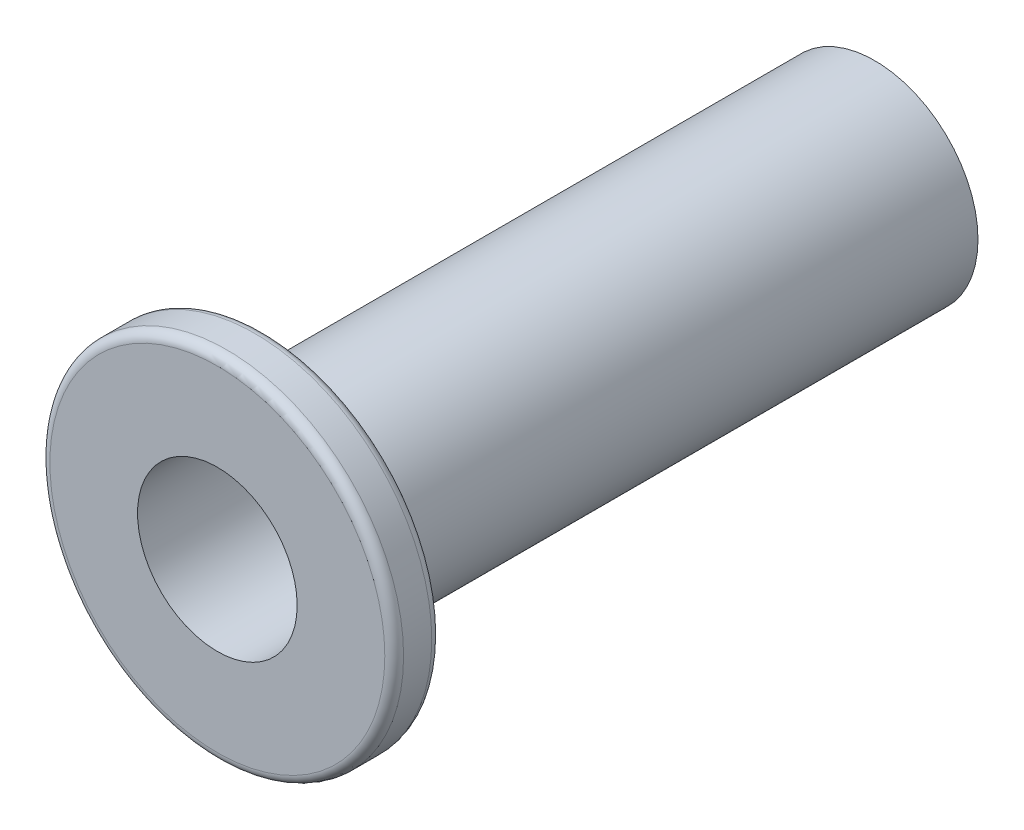
ISO-10303-21;
HEADER;
FILE_DESCRIPTION(('STEP AP214'),'2;1');
FILE_NAME('part.step','',(''),(''),'','','');
FILE_SCHEMA(('AUTOMOTIVE_DESIGN { 1 0 10303 214 1 1 1 1 }'));
ENDSEC;
DATA;
#1=APPLICATION_CONTEXT('core data for automotive mechanical design processes');
#2=APPLICATION_PROTOCOL_DEFINITION('international standard','automotive_design',2000,#1);
#3=PRODUCT_CONTEXT('',#1,'mechanical');
#4=PRODUCT('Part','Part','',(#3));
#5=PRODUCT_RELATED_PRODUCT_CATEGORY('part','',(#4));
#6=PRODUCT_DEFINITION_FORMATION('','',#4);
#7=PRODUCT_DEFINITION_CONTEXT('part definition',#1,'design');
#8=PRODUCT_DEFINITION('design','',#6,#7);
#9=PRODUCT_DEFINITION_SHAPE('','',#8);
#10=(LENGTH_UNIT() NAMED_UNIT(*) SI_UNIT(.MILLI.,.METRE.));
#11=(NAMED_UNIT(*) PLANE_ANGLE_UNIT() SI_UNIT($,.RADIAN.));
#12=(NAMED_UNIT(*) SI_UNIT($,.STERADIAN.) SOLID_ANGLE_UNIT());
#13=UNCERTAINTY_MEASURE_WITH_UNIT(LENGTH_MEASURE(1.E-05),#10,'distance_accuracy_value','');
#14=(GEOMETRIC_REPRESENTATION_CONTEXT(3) GLOBAL_UNCERTAINTY_ASSIGNED_CONTEXT((#13)) GLOBAL_UNIT_ASSIGNED_CONTEXT((#10,
#11,#12)) REPRESENTATION_CONTEXT('',''));
#15=CARTESIAN_POINT('',(0.,0.,0.));
#16=DIRECTION('',(0.,0.,1.));
#17=DIRECTION('',(1.,0.,0.));
#18=AXIS2_PLACEMENT_3D('',#15,#16,#17);
#19=CARTESIAN_POINT('',(0.,0.,120.));
#20=DIRECTION('',(0.,0.,-1.));
#21=DIRECTION('',(-1.,0.,0.));
#22=AXIS2_PLACEMENT_3D('',#19,#20,#21);
#23=CYLINDRICAL_SURFACE('',#22,22.);
#24=CARTESIAN_POINT('',(0.,0.,110.));
#25=DIRECTION('',(0.,0.,1.));
#26=DIRECTION('',(1.,0.,0.));
#27=AXIS2_PLACEMENT_3D('',#24,#25,#26);
#28=CIRCLE('',#27,22.);
#29=CARTESIAN_POINT('',(22.,0.,110.));
#30=VERTEX_POINT('',#29);
#31=EDGE_CURVE('E53',#30,#30,#28,.F.);
#32=ORIENTED_EDGE('',*,*,#31,.T.);
#33=EDGE_LOOP('',(#32));
#34=FACE_BOUND('',#33,.T.);
#35=CARTESIAN_POINT('',(0.,0.,-10.));
#36=DIRECTION('',(0.,0.,-1.));
#37=DIRECTION('',(-1.,0.,0.));
#38=AXIS2_PLACEMENT_3D('',#35,#36,#37);
#39=CIRCLE('',#38,22.);
#40=CARTESIAN_POINT('',(-22.,0.,-10.));
#41=VERTEX_POINT('',#40);
#42=EDGE_CURVE('E65',#41,#41,#39,.T.);
#43=ORIENTED_EDGE('',*,*,#42,.F.);
#44=EDGE_LOOP('',(#43));
#45=FACE_BOUND('',#44,.T.);
#46=ADVANCED_FACE('F33',(#34,#45),#23,.T.);
#47=CARTESIAN_POINT('',(0.,0.,120.));
#48=DIRECTION('',(0.,0.,-1.));
#49=DIRECTION('',(-1.,0.,0.));
#50=AXIS2_PLACEMENT_3D('',#47,#48,#49);
#51=CYLINDRICAL_SURFACE('',#50,17.);
#52=CARTESIAN_POINT('',(0.,0.,0.));
#53=DIRECTION('',(0.,0.,1.));
#54=DIRECTION('',(1.,0.,0.));
#55=AXIS2_PLACEMENT_3D('',#52,#53,#54);
#56=CIRCLE('',#55,17.);
#57=CARTESIAN_POINT('',(17.,0.,0.));
#58=VERTEX_POINT('',#57);
#59=EDGE_CURVE('E59',#58,#58,#56,.T.);
#60=ORIENTED_EDGE('',*,*,#59,.F.);
#61=EDGE_LOOP('',(#60));
#62=FACE_BOUND('',#61,.T.);
#63=CARTESIAN_POINT('',(0.,0.,130.));
#64=DIRECTION('',(0.,0.,1.));
#65=DIRECTION('',(1.,0.,0.));
#66=AXIS2_PLACEMENT_3D('',#63,#64,#65);
#67=CIRCLE('',#66,17.);
#68=CARTESIAN_POINT('',(17.,0.,130.));
#69=VERTEX_POINT('',#68);
#70=EDGE_CURVE('E62',#69,#69,#67,.T.);
#71=ORIENTED_EDGE('',*,*,#70,.T.);
#72=EDGE_LOOP('',(#71));
#73=FACE_BOUND('',#72,.T.);
#74=ADVANCED_FACE('F72',(#62,#73),#51,.F.);
#75=CARTESIAN_POINT('',(0.,0.,130.));
#76=DIRECTION('',(0.,0.,1.));
#77=DIRECTION('',(1.,0.,0.));
#78=AXIS2_PLACEMENT_3D('',#75,#76,#77);
#79=PLANE('',#78);
#80=CARTESIAN_POINT('',(0.,0.,130.));
#81=DIRECTION('',(0.,0.,1.));
#82=DIRECTION('',(1.,0.,0.));
#83=AXIS2_PLACEMENT_3D('',#80,#81,#82);
#84=CIRCLE('',#83,35.6651248695537);
#85=CARTESIAN_POINT('',(35.6651248695537,0.,130.));
#86=VERTEX_POINT('',#85);
#87=EDGE_CURVE('E48',#86,#86,#84,.T.);
#88=ORIENTED_EDGE('',*,*,#87,.T.);
#89=EDGE_LOOP('',(#88));
#90=FACE_BOUND('',#89,.T.);
#91=ORIENTED_EDGE('',*,*,#70,.F.);
#92=EDGE_LOOP('',(#91));
#93=FACE_BOUND('',#92,.T.);
#94=ADVANCED_FACE('F78',(#90,#93),#79,.T.);
#95=CARTESIAN_POINT('',(0.,0.,120.));
#96=DIRECTION('',(0.,0.,1.));
#97=DIRECTION('',(1.,0.,0.));
#98=AXIS2_PLACEMENT_3D('',#95,#96,#97);
#99=PLANE('',#98);
#100=CARTESIAN_POINT('',(0.,0.,120.));
#101=DIRECTION('',(0.,0.,1.));
#102=DIRECTION('',(1.,0.,0.));
#103=AXIS2_PLACEMENT_3D('',#100,#101,#102);
#104=CIRCLE('',#103,35.6651248695537);
#105=CARTESIAN_POINT('',(35.6651248695537,0.,120.));
#106=VERTEX_POINT('',#105);
#107=EDGE_CURVE('E10',#106,#106,#104,.F.);
#108=ORIENTED_EDGE('',*,*,#107,.T.);
#109=EDGE_LOOP('',(#108));
#110=FACE_BOUND('',#109,.T.);
#111=CARTESIAN_POINT('',(0.,0.,120.));
#112=DIRECTION('',(0.,0.,1.));
#113=DIRECTION('',(1.,0.,0.));
#114=AXIS2_PLACEMENT_3D('',#111,#112,#113);
#115=CIRCLE('',#114,32.);
#116=CARTESIAN_POINT('',(32.,0.,120.));
#117=VERTEX_POINT('',#116);
#118=EDGE_CURVE('E56',#117,#117,#115,.T.);
#119=ORIENTED_EDGE('',*,*,#118,.T.);
#120=EDGE_LOOP('',(#119));
#121=FACE_BOUND('',#120,.T.);
#122=ADVANCED_FACE('F100',(#110,#121),#99,.F.);
#123=CARTESIAN_POINT('',(0.,0.,130.));
#124=DIRECTION('',(0.,0.,-1.));
#125=DIRECTION('',(-1.,0.,0.));
#126=AXIS2_PLACEMENT_3D('',#123,#124,#125);
#127=CYLINDRICAL_SURFACE('',#126,37.6651248695537);
#128=CARTESIAN_POINT('',(0.,0.,128.));
#129=DIRECTION('',(0.,0.,1.));
#130=DIRECTION('',(1.,0.,0.));
#131=AXIS2_PLACEMENT_3D('',#128,#129,#130);
#132=CIRCLE('',#131,37.6651248695537);
#133=CARTESIAN_POINT('',(37.6651248695537,0.,128.));
#134=VERTEX_POINT('',#133);
#135=EDGE_CURVE('E40',#134,#134,#132,.F.);
#136=ORIENTED_EDGE('',*,*,#135,.T.);
#137=EDGE_LOOP('',(#136));
#138=FACE_BOUND('',#137,.T.);
#139=CARTESIAN_POINT('',(0.,0.,122.));
#140=DIRECTION('',(0.,0.,1.));
#141=DIRECTION('',(1.,0.,0.));
#142=AXIS2_PLACEMENT_3D('',#139,#140,#141);
#143=CIRCLE('',#142,37.6651248695537);
#144=CARTESIAN_POINT('',(37.6651248695537,0.,122.));
#145=VERTEX_POINT('',#144);
#146=EDGE_CURVE('E44',#145,#145,#143,.T.);
#147=ORIENTED_EDGE('',*,*,#146,.T.);
#148=EDGE_LOOP('',(#147));
#149=FACE_BOUND('',#148,.T.);
#150=ADVANCED_FACE('F86',(#138,#149),#127,.T.);
#151=CARTESIAN_POINT('',(0.,0.,110.));
#152=DIRECTION('',(0.,0.,1.));
#153=DIRECTION('',(1.,0.,0.));
#154=AXIS2_PLACEMENT_3D('',#151,#152,#153);
#155=TOROIDAL_SURFACE('',#154,32.,10.);
#156=ORIENTED_EDGE('',*,*,#31,.F.);
#157=EDGE_LOOP('',(#156));
#158=FACE_BOUND('',#157,.T.);
#159=ORIENTED_EDGE('',*,*,#118,.F.);
#160=EDGE_LOOP('',(#159));
#161=FACE_BOUND('',#160,.T.);
#162=ADVANCED_FACE('F83',(#158,#161),#155,.F.);
#163=CARTESIAN_POINT('',(0.,0.,128.));
#164=DIRECTION('',(0.,0.,1.));
#165=DIRECTION('',(1.,0.,0.));
#166=AXIS2_PLACEMENT_3D('',#163,#164,#165);
#167=TOROIDAL_SURFACE('',#166,35.6651248695537,2.);
#168=ORIENTED_EDGE('',*,*,#135,.F.);
#169=EDGE_LOOP('',(#168));
#170=FACE_BOUND('',#169,.T.);
#171=ORIENTED_EDGE('',*,*,#87,.F.);
#172=EDGE_LOOP('',(#171));
#173=FACE_BOUND('',#172,.T.);
#174=ADVANCED_FACE('F85',(#170,#173),#167,.T.);
#175=CARTESIAN_POINT('',(0.,0.,122.));
#176=DIRECTION('',(0.,0.,1.));
#177=DIRECTION('',(1.,0.,0.));
#178=AXIS2_PLACEMENT_3D('',#175,#176,#177);
#179=TOROIDAL_SURFACE('',#178,35.6651248695537,2.);
#180=ORIENTED_EDGE('',*,*,#107,.F.);
#181=EDGE_LOOP('',(#180));
#182=FACE_BOUND('',#181,.T.);
#183=ORIENTED_EDGE('',*,*,#146,.F.);
#184=EDGE_LOOP('',(#183));
#185=FACE_BOUND('',#184,.T.);
#186=ADVANCED_FACE('F35',(#182,#185),#179,.T.);
#187=CARTESIAN_POINT('',(0.,0.,0.));
#188=DIRECTION('',(0.,0.,-1.));
#189=DIRECTION('',(-1.,0.,0.));
#190=AXIS2_PLACEMENT_3D('',#187,#188,#189);
#191=PLANE('',#190);
#192=ORIENTED_EDGE('',*,*,#59,.T.);
#193=EDGE_LOOP('',(#192));
#194=FACE_BOUND('',#193,.T.);
#195=ADVANCED_FACE('F93',(#194),#191,.F.);
#196=CARTESIAN_POINT('',(0.,0.,-10.));
#197=DIRECTION('',(0.,0.,-1.));
#198=DIRECTION('',(-1.,0.,0.));
#199=AXIS2_PLACEMENT_3D('',#196,#197,#198);
#200=PLANE('',#199);
#201=ORIENTED_EDGE('',*,*,#42,.T.);
#202=EDGE_LOOP('',(#201));
#203=FACE_BOUND('',#202,.T.);
#204=ADVANCED_FACE('F69',(#203),#200,.T.);
#205=CLOSED_SHELL('',(#46,#74,#94,#122,#150,#162,#174,#186,#195,#204));
#206=MANIFOLD_SOLID_BREP('B2',#205);
#207=ADVANCED_BREP_SHAPE_REPRESENTATION('',(#18,#206),#14);
#208=SHAPE_DEFINITION_REPRESENTATION(#9,#207);
ENDSEC;
END-ISO-10303-21;
